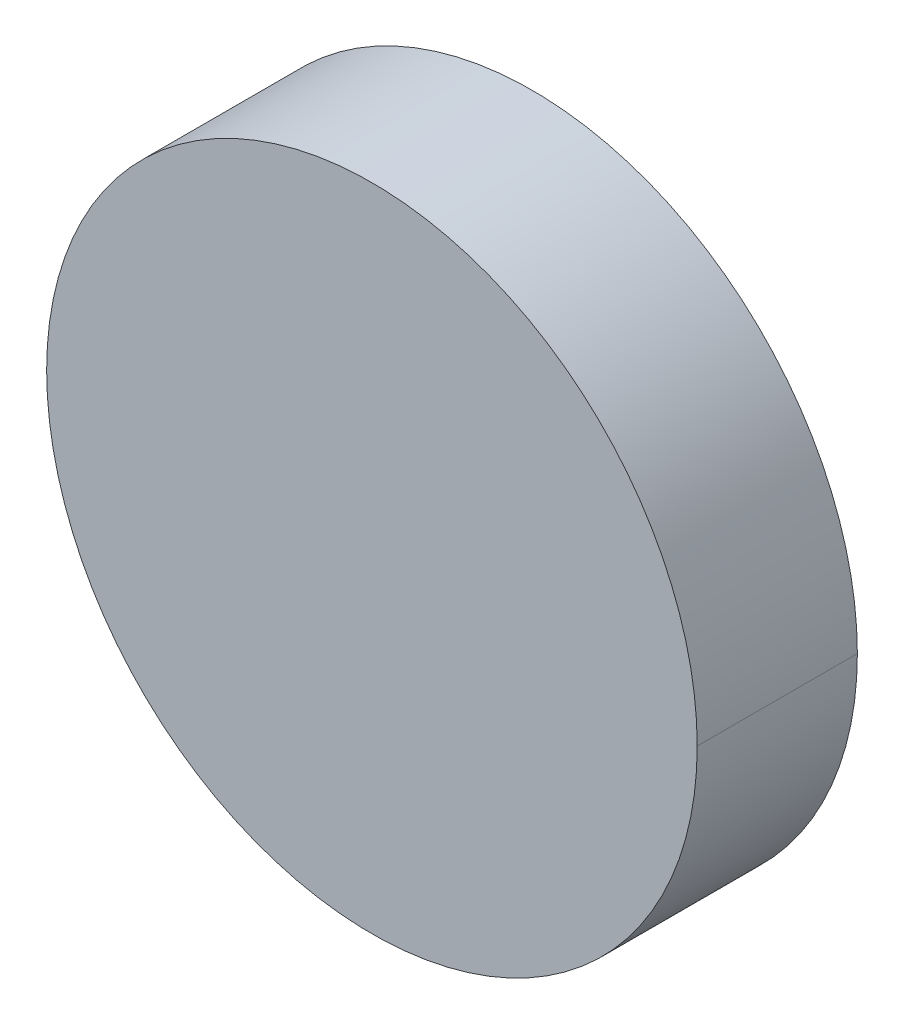
ISO-10303-21;
HEADER;
FILE_DESCRIPTION(('STEP AP214'),'2;1');
FILE_NAME('part.step','',(''),(''),'','','');
FILE_SCHEMA(('AUTOMOTIVE_DESIGN { 1 0 10303 214 1 1 1 1 }'));
ENDSEC;
DATA;
#1=APPLICATION_CONTEXT('core data for automotive mechanical design processes');
#2=APPLICATION_PROTOCOL_DEFINITION('international standard','automotive_design',2000,#1);
#3=PRODUCT_CONTEXT('',#1,'mechanical');
#4=PRODUCT('Part','Part','',(#3));
#5=PRODUCT_RELATED_PRODUCT_CATEGORY('part','',(#4));
#6=PRODUCT_DEFINITION_FORMATION('','',#4);
#7=PRODUCT_DEFINITION_CONTEXT('part definition',#1,'design');
#8=PRODUCT_DEFINITION('design','',#6,#7);
#9=PRODUCT_DEFINITION_SHAPE('','',#8);
#10=(LENGTH_UNIT() NAMED_UNIT(*) SI_UNIT(.MILLI.,.METRE.));
#11=(NAMED_UNIT(*) PLANE_ANGLE_UNIT() SI_UNIT($,.RADIAN.));
#12=(NAMED_UNIT(*) SI_UNIT($,.STERADIAN.) SOLID_ANGLE_UNIT());
#13=UNCERTAINTY_MEASURE_WITH_UNIT(LENGTH_MEASURE(1.E-05),#10,'distance_accuracy_value','');
#14=(GEOMETRIC_REPRESENTATION_CONTEXT(3) GLOBAL_UNCERTAINTY_ASSIGNED_CONTEXT((#13)) GLOBAL_UNIT_ASSIGNED_CONTEXT((#10,
#11,#12)) REPRESENTATION_CONTEXT('',''));
#15=CARTESIAN_POINT('',(0.,0.,0.));
#16=DIRECTION('',(0.,0.,1.));
#17=DIRECTION('',(1.,0.,0.));
#18=AXIS2_PLACEMENT_3D('',#15,#16,#17);
#19=CARTESIAN_POINT('',(3.25000112,0.,1.59999934));
#20=DIRECTION('',(0.,0.,-1.));
#21=DIRECTION('',(0.,-1.,0.));
#22=AXIS2_PLACEMENT_3D('',#19,#20,#21);
#23=PLANE('',#22);
#24=CARTESIAN_POINT('',(0.,0.,1.59999934));
#25=DIRECTION('',(0.,0.,1.));
#26=DIRECTION('',(-1.,0.,0.));
#27=AXIS2_PLACEMENT_3D('',#24,#25,#26);
#28=CIRCLE('',#27,3.25000112);
#29=CARTESIAN_POINT('',(-3.25000112,0.,1.59999934));
#30=VERTEX_POINT('',#29);
#31=CARTESIAN_POINT('',(3.25000112,0.,1.59999934));
#32=VERTEX_POINT('',#31);
#33=EDGE_CURVE('E62',#30,#32,#28,.T.);
#34=ORIENTED_EDGE('',*,*,#33,.T.);
#35=CARTESIAN_POINT('',(0.,0.,1.59999934));
#36=DIRECTION('',(0.,0.,1.));
#37=DIRECTION('',(1.,0.,0.));
#38=AXIS2_PLACEMENT_3D('',#35,#36,#37);
#39=CIRCLE('',#38,3.25000112);
#40=EDGE_CURVE('E28',#32,#30,#39,.T.);
#41=ORIENTED_EDGE('',*,*,#40,.T.);
#42=EDGE_LOOP('',(#34,#41));
#43=FACE_BOUND('',#42,.T.);
#44=ADVANCED_FACE('F17',(#43),#23,.F.);
#45=CARTESIAN_POINT('',(3.25000112,0.,0.));
#46=DIRECTION('',(0.,0.,-1.));
#47=DIRECTION('',(0.,-1.,0.));
#48=AXIS2_PLACEMENT_3D('',#45,#46,#47);
#49=PLANE('',#48);
#50=CARTESIAN_POINT('',(0.,0.,0.));
#51=DIRECTION('',(0.,0.,1.));
#52=DIRECTION('',(-1.,0.,0.));
#53=AXIS2_PLACEMENT_3D('',#50,#51,#52);
#54=CIRCLE('',#53,3.25000112);
#55=CARTESIAN_POINT('',(-3.25000112,0.,0.));
#56=VERTEX_POINT('',#55);
#57=CARTESIAN_POINT('',(3.25000112,0.,0.));
#58=VERTEX_POINT('',#57);
#59=EDGE_CURVE('E55',#56,#58,#54,.T.);
#60=ORIENTED_EDGE('',*,*,#59,.F.);
#61=CARTESIAN_POINT('',(0.,0.,0.));
#62=DIRECTION('',(0.,0.,1.));
#63=DIRECTION('',(1.,0.,0.));
#64=AXIS2_PLACEMENT_3D('',#61,#62,#63);
#65=CIRCLE('',#64,3.25000112);
#66=EDGE_CURVE('E11',#58,#56,#65,.T.);
#67=ORIENTED_EDGE('',*,*,#66,.F.);
#68=EDGE_LOOP('',(#60,#67));
#69=FACE_BOUND('',#68,.T.);
#70=ADVANCED_FACE('F19',(#69),#49,.T.);
#71=CARTESIAN_POINT('',(0.,0.,0.));
#72=DIRECTION('',(0.,0.,-1.));
#73=DIRECTION('',(1.,0.,0.));
#74=AXIS2_PLACEMENT_3D('',#71,#72,#73);
#75=CYLINDRICAL_SURFACE('',#74,3.25000112);
#76=ORIENTED_EDGE('',*,*,#40,.F.);
#77=DIRECTION('',(0.,0.,-1.));
#78=VECTOR('',#77,1.);
#79=CARTESIAN_POINT('',(3.25000112,0.,1.59999934));
#80=LINE('',#79,#78);
#81=EDGE_CURVE('E57',#32,#58,#80,.T.);
#82=ORIENTED_EDGE('',*,*,#81,.T.);
#83=ORIENTED_EDGE('',*,*,#66,.T.);
#84=DIRECTION('',(0.,0.,-1.));
#85=VECTOR('',#84,1.);
#86=CARTESIAN_POINT('',(-3.25000112,0.,1.59999934));
#87=LINE('',#86,#85);
#88=EDGE_CURVE('E21',#30,#56,#87,.T.);
#89=ORIENTED_EDGE('',*,*,#88,.F.);
#90=EDGE_LOOP('',(#76,#82,#83,#89));
#91=FACE_BOUND('',#90,.T.);
#92=ADVANCED_FACE('F58',(#91),#75,.T.);
#93=CARTESIAN_POINT('',(0.,0.,0.));
#94=DIRECTION('',(0.,0.,-1.));
#95=DIRECTION('',(1.,0.,0.));
#96=AXIS2_PLACEMENT_3D('',#93,#94,#95);
#97=CYLINDRICAL_SURFACE('',#96,3.25000112);
#98=ORIENTED_EDGE('',*,*,#59,.T.);
#99=ORIENTED_EDGE('',*,*,#81,.F.);
#100=ORIENTED_EDGE('',*,*,#33,.F.);
#101=ORIENTED_EDGE('',*,*,#88,.T.);
#102=EDGE_LOOP('',(#98,#99,#100,#101));
#103=FACE_BOUND('',#102,.T.);
#104=ADVANCED_FACE('F63',(#103),#97,.T.);
#105=CLOSED_SHELL('',(#44,#70,#92,#104));
#106=MANIFOLD_SOLID_BREP('B1',#105);
#107=ADVANCED_BREP_SHAPE_REPRESENTATION('',(#18,#106),#14);
#108=SHAPE_DEFINITION_REPRESENTATION(#9,#107);
ENDSEC;
END-ISO-10303-21;
